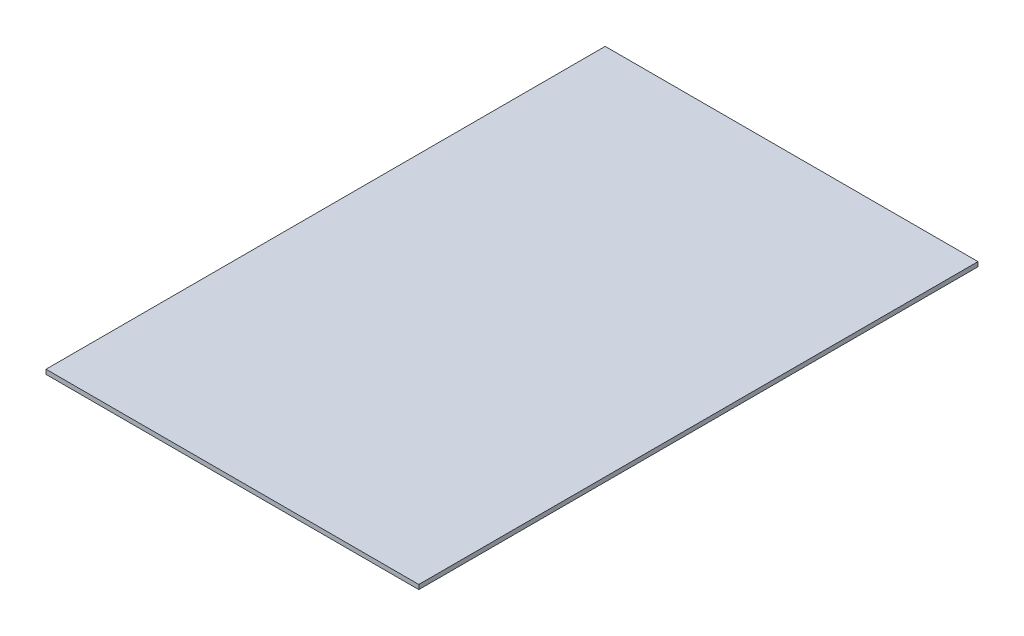
ISO-10303-21;
HEADER;
FILE_DESCRIPTION(('STEP AP214'),'2;1');
FILE_NAME('part.step','',(''),(''),'','','');
FILE_SCHEMA(('AUTOMOTIVE_DESIGN { 1 0 10303 214 1 1 1 1 }'));
ENDSEC;
DATA;
#1=APPLICATION_CONTEXT('core data for automotive mechanical design processes');
#2=APPLICATION_PROTOCOL_DEFINITION('international standard','automotive_design',2000,#1);
#3=PRODUCT_CONTEXT('',#1,'mechanical');
#4=PRODUCT('Part','Part','',(#3));
#5=PRODUCT_RELATED_PRODUCT_CATEGORY('part','',(#4));
#6=PRODUCT_DEFINITION_FORMATION('','',#4);
#7=PRODUCT_DEFINITION_CONTEXT('part definition',#1,'design');
#8=PRODUCT_DEFINITION('design','',#6,#7);
#9=PRODUCT_DEFINITION_SHAPE('','',#8);
#10=(LENGTH_UNIT() NAMED_UNIT(*) SI_UNIT(.MILLI.,.METRE.));
#11=(NAMED_UNIT(*) PLANE_ANGLE_UNIT() SI_UNIT($,.RADIAN.));
#12=(NAMED_UNIT(*) SI_UNIT($,.STERADIAN.) SOLID_ANGLE_UNIT());
#13=UNCERTAINTY_MEASURE_WITH_UNIT(LENGTH_MEASURE(1.E-05),#10,'distance_accuracy_value','');
#14=(GEOMETRIC_REPRESENTATION_CONTEXT(3) GLOBAL_UNCERTAINTY_ASSIGNED_CONTEXT((#13)) GLOBAL_UNIT_ASSIGNED_CONTEXT((#10,
#11,#12)) REPRESENTATION_CONTEXT('',''));
#15=CARTESIAN_POINT('',(0.,0.,0.));
#16=DIRECTION('',(0.,0.,1.));
#17=DIRECTION('',(1.,0.,0.));
#18=AXIS2_PLACEMENT_3D('',#15,#16,#17);
#19=CARTESIAN_POINT('',(0.,4.826,0.));
#20=DIRECTION('',(0.,0.,-1.));
#21=DIRECTION('',(-1.,0.,0.));
#22=AXIS2_PLACEMENT_3D('',#19,#20,#21);
#23=PLANE('',#22);
#24=DIRECTION('',(1.,0.,0.));
#25=VECTOR('',#24,1.);
#26=CARTESIAN_POINT('',(0.,0.,0.));
#27=LINE('',#26,#25);
#28=CARTESIAN_POINT('',(0.,0.,0.));
#29=VERTEX_POINT('',#28);
#30=CARTESIAN_POINT('',(400.,0.,0.));
#31=VERTEX_POINT('',#30);
#32=EDGE_CURVE('E101',#29,#31,#27,.T.);
#33=ORIENTED_EDGE('',*,*,#32,.T.);
#34=DIRECTION('',(0.,-1.,0.));
#35=VECTOR('',#34,1.);
#36=CARTESIAN_POINT('',(400.,4.826,0.));
#37=LINE('',#36,#35);
#38=CARTESIAN_POINT('',(400.,4.826,0.));
#39=VERTEX_POINT('',#38);
#40=EDGE_CURVE('E11',#39,#31,#37,.T.);
#41=ORIENTED_EDGE('',*,*,#40,.F.);
#42=DIRECTION('',(1.,0.,0.));
#43=VECTOR('',#42,1.);
#44=CARTESIAN_POINT('',(0.,4.826,0.));
#45=LINE('',#44,#43);
#46=CARTESIAN_POINT('',(0.,4.826,0.));
#47=VERTEX_POINT('',#46);
#48=EDGE_CURVE('E87',#47,#39,#45,.T.);
#49=ORIENTED_EDGE('',*,*,#48,.F.);
#50=DIRECTION('',(0.,-1.,0.));
#51=VECTOR('',#50,1.);
#52=CARTESIAN_POINT('',(0.,4.826,0.));
#53=LINE('',#52,#51);
#54=EDGE_CURVE('E54',#47,#29,#53,.T.);
#55=ORIENTED_EDGE('',*,*,#54,.T.);
#56=EDGE_LOOP('',(#33,#41,#49,#55));
#57=FACE_BOUND('',#56,.T.);
#58=ADVANCED_FACE('F38',(#57),#23,.F.);
#59=CARTESIAN_POINT('',(400.,4.826,0.));
#60=DIRECTION('',(-1.,0.,0.));
#61=DIRECTION('',(0.,0.,1.));
#62=AXIS2_PLACEMENT_3D('',#59,#60,#61);
#63=PLANE('',#62);
#64=DIRECTION('',(0.,0.,-1.));
#65=VECTOR('',#64,1.);
#66=CARTESIAN_POINT('',(400.,0.,0.));
#67=LINE('',#66,#65);
#68=CARTESIAN_POINT('',(400.,0.,-600.));
#69=VERTEX_POINT('',#68);
#70=EDGE_CURVE('E92',#31,#69,#67,.T.);
#71=ORIENTED_EDGE('',*,*,#70,.T.);
#72=DIRECTION('',(0.,-1.,0.));
#73=VECTOR('',#72,1.);
#74=CARTESIAN_POINT('',(400.,4.826,-600.));
#75=LINE('',#74,#73);
#76=CARTESIAN_POINT('',(400.,4.826,-600.));
#77=VERTEX_POINT('',#76);
#78=EDGE_CURVE('E46',#77,#69,#75,.T.);
#79=ORIENTED_EDGE('',*,*,#78,.F.);
#80=DIRECTION('',(0.,0.,-1.));
#81=VECTOR('',#80,1.);
#82=CARTESIAN_POINT('',(400.,4.826,0.));
#83=LINE('',#82,#81);
#84=EDGE_CURVE('E79',#39,#77,#83,.T.);
#85=ORIENTED_EDGE('',*,*,#84,.F.);
#86=ORIENTED_EDGE('',*,*,#40,.T.);
#87=EDGE_LOOP('',(#71,#79,#85,#86));
#88=FACE_BOUND('',#87,.T.);
#89=ADVANCED_FACE('F91',(#88),#63,.F.);
#90=CARTESIAN_POINT('',(0.,4.826,-600.));
#91=DIRECTION('',(0.,0.,-1.));
#92=DIRECTION('',(-1.,0.,0.));
#93=AXIS2_PLACEMENT_3D('',#90,#91,#92);
#94=PLANE('',#93);
#95=DIRECTION('',(1.,0.,0.));
#96=VECTOR('',#95,1.);
#97=CARTESIAN_POINT('',(0.,0.,-600.));
#98=LINE('',#97,#96);
#99=CARTESIAN_POINT('',(0.,0.,-600.));
#100=VERTEX_POINT('',#99);
#101=EDGE_CURVE('E104',#100,#69,#98,.T.);
#102=ORIENTED_EDGE('',*,*,#101,.F.);
#103=DIRECTION('',(0.,-1.,0.));
#104=VECTOR('',#103,1.);
#105=CARTESIAN_POINT('',(0.,4.826,-600.));
#106=LINE('',#105,#104);
#107=CARTESIAN_POINT('',(0.,4.826,-600.));
#108=VERTEX_POINT('',#107);
#109=EDGE_CURVE('E68',#108,#100,#106,.T.);
#110=ORIENTED_EDGE('',*,*,#109,.F.);
#111=DIRECTION('',(1.,0.,0.));
#112=VECTOR('',#111,1.);
#113=CARTESIAN_POINT('',(0.,4.826,-600.));
#114=LINE('',#113,#112);
#115=EDGE_CURVE('E86',#108,#77,#114,.T.);
#116=ORIENTED_EDGE('',*,*,#115,.T.);
#117=ORIENTED_EDGE('',*,*,#78,.T.);
#118=EDGE_LOOP('',(#102,#110,#116,#117));
#119=FACE_BOUND('',#118,.T.);
#120=ADVANCED_FACE('F95',(#119),#94,.T.);
#121=CARTESIAN_POINT('',(0.,4.826,0.));
#122=DIRECTION('',(-1.,0.,0.));
#123=DIRECTION('',(0.,0.,1.));
#124=AXIS2_PLACEMENT_3D('',#121,#122,#123);
#125=PLANE('',#124);
#126=DIRECTION('',(0.,0.,-1.));
#127=VECTOR('',#126,1.);
#128=CARTESIAN_POINT('',(0.,0.,0.));
#129=LINE('',#128,#127);
#130=EDGE_CURVE('E106',#29,#100,#129,.T.);
#131=ORIENTED_EDGE('',*,*,#130,.F.);
#132=ORIENTED_EDGE('',*,*,#54,.F.);
#133=DIRECTION('',(0.,0.,-1.));
#134=VECTOR('',#133,1.);
#135=CARTESIAN_POINT('',(0.,4.826,0.));
#136=LINE('',#135,#134);
#137=EDGE_CURVE('E96',#47,#108,#136,.T.);
#138=ORIENTED_EDGE('',*,*,#137,.T.);
#139=ORIENTED_EDGE('',*,*,#109,.T.);
#140=EDGE_LOOP('',(#131,#132,#138,#139));
#141=FACE_BOUND('',#140,.T.);
#142=ADVANCED_FACE('F112',(#141),#125,.T.);
#143=CARTESIAN_POINT('',(0.,4.826,0.));
#144=DIRECTION('',(0.,1.,0.));
#145=DIRECTION('',(0.,0.,1.));
#146=AXIS2_PLACEMENT_3D('',#143,#144,#145);
#147=PLANE('',#146);
#148=ORIENTED_EDGE('',*,*,#48,.T.);
#149=ORIENTED_EDGE('',*,*,#84,.T.);
#150=ORIENTED_EDGE('',*,*,#115,.F.);
#151=ORIENTED_EDGE('',*,*,#137,.F.);
#152=EDGE_LOOP('',(#148,#149,#150,#151));
#153=FACE_BOUND('',#152,.T.);
#154=ADVANCED_FACE('F83',(#153),#147,.T.);
#155=CARTESIAN_POINT('',(0.,0.,0.));
#156=DIRECTION('',(0.,1.,0.));
#157=DIRECTION('',(0.,0.,1.));
#158=AXIS2_PLACEMENT_3D('',#155,#156,#157);
#159=PLANE('',#158);
#160=ORIENTED_EDGE('',*,*,#32,.F.);
#161=ORIENTED_EDGE('',*,*,#130,.T.);
#162=ORIENTED_EDGE('',*,*,#101,.T.);
#163=ORIENTED_EDGE('',*,*,#70,.F.);
#164=EDGE_LOOP('',(#160,#161,#162,#163));
#165=FACE_BOUND('',#164,.T.);
#166=ADVANCED_FACE('F111',(#165),#159,.F.);
#167=CLOSED_SHELL('',(#58,#89,#120,#142,#154,#166));
#168=MANIFOLD_SOLID_BREP('B2',#167);
#169=ADVANCED_BREP_SHAPE_REPRESENTATION('',(#18,#168),#14);
#170=SHAPE_DEFINITION_REPRESENTATION(#9,#169);
ENDSEC;
END-ISO-10303-21;
